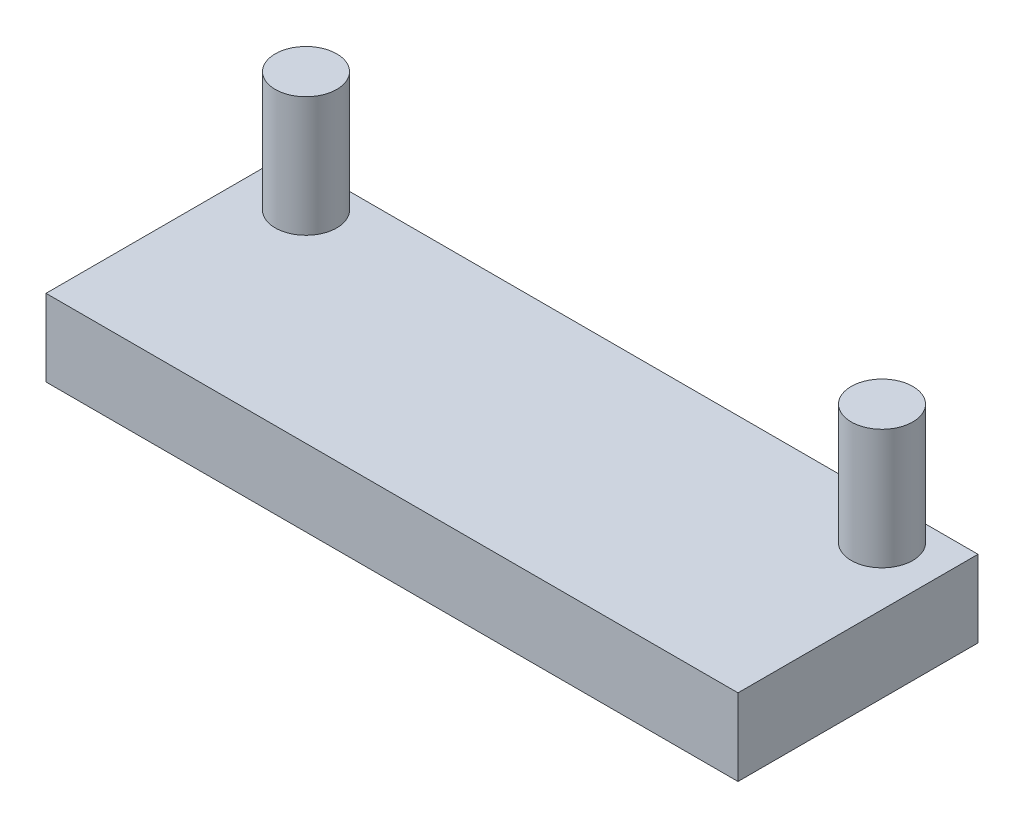
ISO-10303-21;
HEADER;
FILE_DESCRIPTION(('STEP AP214'),'2;1');
FILE_NAME('part.step','',(''),(''),'','','');
FILE_SCHEMA(('AUTOMOTIVE_DESIGN { 1 0 10303 214 1 1 1 1 }'));
ENDSEC;
DATA;
#1=APPLICATION_CONTEXT('core data for automotive mechanical design processes');
#2=APPLICATION_PROTOCOL_DEFINITION('international standard','automotive_design',2000,#1);
#3=PRODUCT_CONTEXT('',#1,'mechanical');
#4=PRODUCT('Part','Part','',(#3));
#5=PRODUCT_RELATED_PRODUCT_CATEGORY('part','',(#4));
#6=PRODUCT_DEFINITION_FORMATION('','',#4);
#7=PRODUCT_DEFINITION_CONTEXT('part definition',#1,'design');
#8=PRODUCT_DEFINITION('design','',#6,#7);
#9=PRODUCT_DEFINITION_SHAPE('','',#8);
#10=(LENGTH_UNIT() NAMED_UNIT(*) SI_UNIT(.MILLI.,.METRE.));
#11=(NAMED_UNIT(*) PLANE_ANGLE_UNIT() SI_UNIT($,.RADIAN.));
#12=(NAMED_UNIT(*) SI_UNIT($,.STERADIAN.) SOLID_ANGLE_UNIT());
#13=UNCERTAINTY_MEASURE_WITH_UNIT(LENGTH_MEASURE(1.E-05),#10,'distance_accuracy_value','');
#14=(GEOMETRIC_REPRESENTATION_CONTEXT(3) GLOBAL_UNCERTAINTY_ASSIGNED_CONTEXT((#13)) GLOBAL_UNIT_ASSIGNED_CONTEXT((#10,
#11,#12)) REPRESENTATION_CONTEXT('',''));
#15=CARTESIAN_POINT('',(0.,0.,0.));
#16=DIRECTION('',(0.,0.,1.));
#17=DIRECTION('',(1.,0.,0.));
#18=AXIS2_PLACEMENT_3D('',#15,#16,#17);
#19=CARTESIAN_POINT('',(10.9855,2.4384,-3.81));
#20=DIRECTION('',(0.,0.,1.));
#21=DIRECTION('',(1.,0.,0.));
#22=AXIS2_PLACEMENT_3D('',#19,#20,#21);
#23=PLANE('',#22);
#24=DIRECTION('',(-1.,0.,0.));
#25=VECTOR('',#24,1.);
#26=CARTESIAN_POINT('',(10.9855,0.,-3.81));
#27=LINE('',#26,#25);
#28=CARTESIAN_POINT('',(10.9855,0.,-3.81));
#29=VERTEX_POINT('',#28);
#30=CARTESIAN_POINT('',(-10.9855,0.,-3.81));
#31=VERTEX_POINT('',#30);
#32=EDGE_CURVE('E106',#29,#31,#27,.T.);
#33=ORIENTED_EDGE('',*,*,#32,.T.);
#34=DIRECTION('',(0.,-1.,0.));
#35=VECTOR('',#34,1.);
#36=CARTESIAN_POINT('',(-10.9855,2.4384,-3.81));
#37=LINE('',#36,#35);
#38=CARTESIAN_POINT('',(-10.9855,2.4384,-3.81));
#39=VERTEX_POINT('',#38);
#40=EDGE_CURVE('E45',#39,#31,#37,.T.);
#41=ORIENTED_EDGE('',*,*,#40,.F.);
#42=DIRECTION('',(-1.,0.,0.));
#43=VECTOR('',#42,1.);
#44=CARTESIAN_POINT('',(10.9855,2.4384,-3.81));
#45=LINE('',#44,#43);
#46=CARTESIAN_POINT('',(10.9855,2.4384,-3.81));
#47=VERTEX_POINT('',#46);
#48=EDGE_CURVE('E91',#47,#39,#45,.T.);
#49=ORIENTED_EDGE('',*,*,#48,.F.);
#50=DIRECTION('',(0.,-1.,0.));
#51=VECTOR('',#50,1.);
#52=CARTESIAN_POINT('',(10.9855,2.4384,-3.81));
#53=LINE('',#52,#51);
#54=EDGE_CURVE('E105',#47,#29,#53,.T.);
#55=ORIENTED_EDGE('',*,*,#54,.T.);
#56=EDGE_LOOP('',(#33,#41,#49,#55));
#57=FACE_BOUND('',#56,.T.);
#58=ADVANCED_FACE('F39',(#57),#23,.F.);
#59=CARTESIAN_POINT('',(-10.9855,2.4384,-3.81));
#60=DIRECTION('',(1.,0.,0.));
#61=DIRECTION('',(0.,0.,-1.));
#62=AXIS2_PLACEMENT_3D('',#59,#60,#61);
#63=PLANE('',#62);
#64=DIRECTION('',(0.,0.,1.));
#65=VECTOR('',#64,1.);
#66=CARTESIAN_POINT('',(-10.9855,0.,-3.81));
#67=LINE('',#66,#65);
#68=CARTESIAN_POINT('',(-10.9855,0.,3.81));
#69=VERTEX_POINT('',#68);
#70=EDGE_CURVE('E98',#31,#69,#67,.T.);
#71=ORIENTED_EDGE('',*,*,#70,.T.);
#72=DIRECTION('',(0.,-1.,0.));
#73=VECTOR('',#72,1.);
#74=CARTESIAN_POINT('',(-10.9855,2.4384,3.81));
#75=LINE('',#74,#73);
#76=CARTESIAN_POINT('',(-10.9855,2.4384,3.81));
#77=VERTEX_POINT('',#76);
#78=EDGE_CURVE('E96',#77,#69,#75,.T.);
#79=ORIENTED_EDGE('',*,*,#78,.F.);
#80=DIRECTION('',(0.,0.,1.));
#81=VECTOR('',#80,1.);
#82=CARTESIAN_POINT('',(-10.9855,2.4384,-3.81));
#83=LINE('',#82,#81);
#84=EDGE_CURVE('E86',#39,#77,#83,.T.);
#85=ORIENTED_EDGE('',*,*,#84,.F.);
#86=ORIENTED_EDGE('',*,*,#40,.T.);
#87=EDGE_LOOP('',(#71,#79,#85,#86));
#88=FACE_BOUND('',#87,.T.);
#89=ADVANCED_FACE('F100',(#88),#63,.F.);
#90=CARTESIAN_POINT('',(-10.9855,2.4384,3.81));
#91=DIRECTION('',(0.,0.,-1.));
#92=DIRECTION('',(-1.,0.,0.));
#93=AXIS2_PLACEMENT_3D('',#90,#91,#92);
#94=PLANE('',#93);
#95=DIRECTION('',(1.,0.,0.));
#96=VECTOR('',#95,1.);
#97=CARTESIAN_POINT('',(-10.9855,0.,3.81));
#98=LINE('',#97,#96);
#99=CARTESIAN_POINT('',(10.9855,0.,3.81));
#100=VERTEX_POINT('',#99);
#101=EDGE_CURVE('E74',#69,#100,#98,.T.);
#102=ORIENTED_EDGE('',*,*,#101,.T.);
#103=DIRECTION('',(0.,-1.,0.));
#104=VECTOR('',#103,1.);
#105=CARTESIAN_POINT('',(10.9855,2.4384,3.81));
#106=LINE('',#105,#104);
#107=CARTESIAN_POINT('',(10.9855,2.4384,3.81));
#108=VERTEX_POINT('',#107);
#109=EDGE_CURVE('E97',#108,#100,#106,.T.);
#110=ORIENTED_EDGE('',*,*,#109,.F.);
#111=DIRECTION('',(1.,0.,0.));
#112=VECTOR('',#111,1.);
#113=CARTESIAN_POINT('',(-10.9855,2.4384,3.81));
#114=LINE('',#113,#112);
#115=EDGE_CURVE('E93',#77,#108,#114,.T.);
#116=ORIENTED_EDGE('',*,*,#115,.F.);
#117=ORIENTED_EDGE('',*,*,#78,.T.);
#118=EDGE_LOOP('',(#102,#110,#116,#117));
#119=FACE_BOUND('',#118,.T.);
#120=ADVANCED_FACE('F99',(#119),#94,.F.);
#121=CARTESIAN_POINT('',(10.9855,2.4384,3.81));
#122=DIRECTION('',(-1.,0.,0.));
#123=DIRECTION('',(0.,0.,1.));
#124=AXIS2_PLACEMENT_3D('',#121,#122,#123);
#125=PLANE('',#124);
#126=DIRECTION('',(0.,0.,-1.));
#127=VECTOR('',#126,1.);
#128=CARTESIAN_POINT('',(10.9855,0.,3.81));
#129=LINE('',#128,#127);
#130=EDGE_CURVE('E77',#100,#29,#129,.T.);
#131=ORIENTED_EDGE('',*,*,#130,.T.);
#132=ORIENTED_EDGE('',*,*,#54,.F.);
#133=DIRECTION('',(0.,0.,-1.));
#134=VECTOR('',#133,1.);
#135=CARTESIAN_POINT('',(10.9855,2.4384,3.81));
#136=LINE('',#135,#134);
#137=EDGE_CURVE('E60',#108,#47,#136,.T.);
#138=ORIENTED_EDGE('',*,*,#137,.F.);
#139=ORIENTED_EDGE('',*,*,#109,.T.);
#140=EDGE_LOOP('',(#131,#132,#138,#139));
#141=FACE_BOUND('',#140,.T.);
#142=ADVANCED_FACE('F111',(#141),#125,.F.);
#143=CARTESIAN_POINT('',(0.,2.4384,0.));
#144=DIRECTION('',(0.,1.,0.));
#145=DIRECTION('',(0.,0.,1.));
#146=AXIS2_PLACEMENT_3D('',#143,#144,#145);
#147=PLANE('',#146);
#148=CARTESIAN_POINT('',(-9.144,2.4384,-2.60375203764824));
#149=DIRECTION('',(0.,1.,0.));
#150=DIRECTION('',(0.,0.,1.));
#151=AXIS2_PLACEMENT_3D('',#148,#149,#150);
#152=CIRCLE('',#151,0.9779);
#153=CARTESIAN_POINT('',(-9.144,2.4384,-3.58165203764824));
#154=VERTEX_POINT('',#153);
#155=EDGE_CURVE('E11',#154,#154,#152,.T.);
#156=ORIENTED_EDGE('',*,*,#155,.F.);
#157=EDGE_LOOP('',(#156));
#158=FACE_BOUND('',#157,.T.);
#159=CARTESIAN_POINT('',(9.144,2.4384,-2.60375203764824));
#160=DIRECTION('',(0.,1.,0.));
#161=DIRECTION('',(0.,0.,-1.));
#162=AXIS2_PLACEMENT_3D('',#159,#160,#161);
#163=CIRCLE('',#162,0.9779);
#164=CARTESIAN_POINT('',(9.144,2.4384,-3.58165203764824));
#165=VERTEX_POINT('',#164);
#166=EDGE_CURVE('E48',#165,#165,#163,.T.);
#167=ORIENTED_EDGE('',*,*,#166,.F.);
#168=EDGE_LOOP('',(#167));
#169=FACE_BOUND('',#168,.T.);
#170=ORIENTED_EDGE('',*,*,#48,.T.);
#171=ORIENTED_EDGE('',*,*,#84,.T.);
#172=ORIENTED_EDGE('',*,*,#115,.T.);
#173=ORIENTED_EDGE('',*,*,#137,.T.);
#174=EDGE_LOOP('',(#170,#171,#172,#173));
#175=FACE_BOUND('',#174,.T.);
#176=ADVANCED_FACE('F90',(#158,#169,#175),#147,.T.);
#177=CARTESIAN_POINT('',(0.,0.,0.));
#178=DIRECTION('',(0.,1.,0.));
#179=DIRECTION('',(0.,0.,1.));
#180=AXIS2_PLACEMENT_3D('',#177,#178,#179);
#181=PLANE('',#180);
#182=ORIENTED_EDGE('',*,*,#32,.F.);
#183=ORIENTED_EDGE('',*,*,#130,.F.);
#184=ORIENTED_EDGE('',*,*,#101,.F.);
#185=ORIENTED_EDGE('',*,*,#70,.F.);
#186=EDGE_LOOP('',(#182,#183,#184,#185));
#187=FACE_BOUND('',#186,.T.);
#188=ADVANCED_FACE('F116',(#187),#181,.F.);
#189=CARTESIAN_POINT('',(9.144,6.2484,-2.60375203764824));
#190=DIRECTION('',(0.,-1.,0.));
#191=DIRECTION('',(0.,0.,-1.));
#192=AXIS2_PLACEMENT_3D('',#189,#190,#191);
#193=CYLINDRICAL_SURFACE('',#192,0.9779);
#194=CARTESIAN_POINT('',(9.144,6.2484,-2.60375203764824));
#195=DIRECTION('',(0.,1.,0.));
#196=DIRECTION('',(0.,0.,-1.));
#197=AXIS2_PLACEMENT_3D('',#194,#195,#196);
#198=CIRCLE('',#197,0.9779);
#199=CARTESIAN_POINT('',(9.144,6.2484,-3.58165203764824));
#200=VERTEX_POINT('',#199);
#201=EDGE_CURVE('E117',#200,#200,#198,.T.);
#202=CARTESIAN_POINT('',(9.144,6.2484,-3.58165203764824));
#203=CARTESIAN_POINT('',(9.144,6.2087125,-3.58165203764824));
#204=CARTESIAN_POINT('',(9.144,6.169025,-3.58165203764824));
#205=CARTESIAN_POINT('',(9.144,6.08965,-3.58165203764824));
#206=CARTESIAN_POINT('',(9.144,6.0499625,-3.58165203764824));
#207=CARTESIAN_POINT('',(9.144,5.9705875,-3.58165203764824));
#208=CARTESIAN_POINT('',(9.144,5.9309,-3.58165203764824));
#209=CARTESIAN_POINT('',(9.144,5.851525,-3.58165203764824));
#210=CARTESIAN_POINT('',(9.144,5.8118375,-3.58165203764824));
#211=CARTESIAN_POINT('',(9.144,5.7324625,-3.58165203764824));
#212=CARTESIAN_POINT('',(9.144,5.692775,-3.58165203764824));
#213=CARTESIAN_POINT('',(9.144,5.6134,-3.58165203764824));
#214=CARTESIAN_POINT('',(9.144,5.5737125,-3.58165203764824));
#215=CARTESIAN_POINT('',(9.144,5.4943375,-3.58165203764824));
#216=CARTESIAN_POINT('',(9.144,5.45465,-3.58165203764824));
#217=CARTESIAN_POINT('',(9.144,5.375275,-3.58165203764824));
#218=CARTESIAN_POINT('',(9.144,5.3355875,-3.58165203764824));
#219=CARTESIAN_POINT('',(9.144,5.2562125,-3.58165203764824));
#220=CARTESIAN_POINT('',(9.144,5.216525,-3.58165203764824));
#221=CARTESIAN_POINT('',(9.144,5.13715,-3.58165203764824));
#222=CARTESIAN_POINT('',(9.144,5.0974625,-3.58165203764824));
#223=CARTESIAN_POINT('',(9.144,5.0180875,-3.58165203764824));
#224=CARTESIAN_POINT('',(9.144,4.9784,-3.58165203764824));
#225=CARTESIAN_POINT('',(9.144,4.899025,-3.58165203764824));
#226=CARTESIAN_POINT('',(9.144,4.8593375,-3.58165203764824));
#227=CARTESIAN_POINT('',(9.144,4.7799625,-3.58165203764824));
#228=CARTESIAN_POINT('',(9.144,4.740275,-3.58165203764824));
#229=CARTESIAN_POINT('',(9.144,4.6609,-3.58165203764824));
#230=CARTESIAN_POINT('',(9.144,4.6212125,-3.58165203764824));
#231=CARTESIAN_POINT('',(9.144,4.5418375,-3.58165203764824));
#232=CARTESIAN_POINT('',(9.144,4.50215,-3.58165203764824));
#233=CARTESIAN_POINT('',(9.144,4.422775,-3.58165203764824));
#234=CARTESIAN_POINT('',(9.144,4.3830875,-3.58165203764824));
#235=CARTESIAN_POINT('',(9.144,4.3037125,-3.58165203764824));
#236=CARTESIAN_POINT('',(9.144,4.264025,-3.58165203764824));
#237=CARTESIAN_POINT('',(9.144,4.18465,-3.58165203764824));
#238=CARTESIAN_POINT('',(9.144,4.1449625,-3.58165203764824));
#239=CARTESIAN_POINT('',(9.144,4.0655875,-3.58165203764824));
#240=CARTESIAN_POINT('',(9.144,4.0259,-3.58165203764824));
#241=CARTESIAN_POINT('',(9.144,3.946525,-3.58165203764824));
#242=CARTESIAN_POINT('',(9.144,3.9068375,-3.58165203764824));
#243=CARTESIAN_POINT('',(9.144,3.8274625,-3.58165203764824));
#244=CARTESIAN_POINT('',(9.144,3.787775,-3.58165203764824));
#245=CARTESIAN_POINT('',(9.144,3.7084,-3.58165203764824));
#246=CARTESIAN_POINT('',(9.144,3.6687125,-3.58165203764824));
#247=CARTESIAN_POINT('',(9.144,3.5893375,-3.58165203764824));
#248=CARTESIAN_POINT('',(9.144,3.54965,-3.58165203764824));
#249=CARTESIAN_POINT('',(9.144,3.470275,-3.58165203764824));
#250=CARTESIAN_POINT('',(9.144,3.4305875,-3.58165203764824));
#251=CARTESIAN_POINT('',(9.144,3.3512125,-3.58165203764824));
#252=CARTESIAN_POINT('',(9.144,3.311525,-3.58165203764824));
#253=CARTESIAN_POINT('',(9.144,3.23215,-3.58165203764824));
#254=CARTESIAN_POINT('',(9.144,3.1924625,-3.58165203764824));
#255=CARTESIAN_POINT('',(9.144,3.1130875,-3.58165203764824));
#256=CARTESIAN_POINT('',(9.144,3.0734,-3.58165203764824));
#257=CARTESIAN_POINT('',(9.144,2.994025,-3.58165203764824));
#258=CARTESIAN_POINT('',(9.144,2.9543375,-3.58165203764824));
#259=CARTESIAN_POINT('',(9.144,2.8749625,-3.58165203764824));
#260=CARTESIAN_POINT('',(9.144,2.835275,-3.58165203764824));
#261=CARTESIAN_POINT('',(9.144,2.7559,-3.58165203764824));
#262=CARTESIAN_POINT('',(9.144,2.7162125,-3.58165203764824));
#263=CARTESIAN_POINT('',(9.144,2.6368375,-3.58165203764824));
#264=CARTESIAN_POINT('',(9.144,2.59715,-3.58165203764824));
#265=CARTESIAN_POINT('',(9.144,2.517775,-3.58165203764824));
#266=CARTESIAN_POINT('',(9.144,2.4780875,-3.58165203764824));
#267=CARTESIAN_POINT('',(9.144,2.4384,-3.58165203764824));
#268=B_SPLINE_CURVE_WITH_KNOTS('',3,(#202,#203,#204,#205,#206,#207,#208,#209,#210,#211,#212,
#213,#214,#215,#216,#217,#218,#219,#220,#221,#222,#223,#224,#225,#226,#227,#228,#229,#230,#231,
#232,#233,#234,#235,#236,#237,#238,#239,#240,#241,#242,#243,#244,#245,#246,#247,#248,#249,#250,
#251,#252,#253,#254,#255,#256,#257,#258,#259,#260,#261,#262,#263,#264,#265,#266,#267),
.UNSPECIFIED.,.F.,.F.,(4,2,2,2,2,2,2,2,2,2,2,2,2,2,2,2,2,2,2,2,2,2,2,2,2,2,2,2,2,2,2,2,4),(0.,
0.1190625,0.238125,0.357187500000001,0.47625,0.5953125,0.714375000000001,0.8334375,0.9525,
1.0715625,1.190625,1.3096875,1.42875,1.5478125,1.666875,1.7859375,1.905,2.0240625,2.143125,
2.2621875,2.38125,2.5003125,2.619375,2.7384375,2.8575,2.9765625,3.095625,3.2146875,3.33375,
3.4528125,3.571875,3.6909375,3.81),.UNSPECIFIED.);
#269=EDGE_CURVE('BSEAM142',#200,#165,#268,.T.);
#270=ORIENTED_EDGE('',*,*,#201,.F.);
#271=ORIENTED_EDGE('',*,*,#166,.T.);
#272=ORIENTED_EDGE('',*,*,#269,.T.);
#273=ORIENTED_EDGE('',*,*,#269,.F.);
#274=EDGE_LOOP('',(#270,#272,#271,#273));
#275=FACE_BOUND('',#274,.T.);
#276=ADVANCED_FACE('F142',(#275),#193,.T.);
#277=CARTESIAN_POINT('',(9.144,6.2484,-2.60375203764824));
#278=DIRECTION('',(0.,-1.,0.));
#279=DIRECTION('',(0.,0.,-1.));
#280=AXIS2_PLACEMENT_3D('',#277,#278,#279);
#281=PLANE('',#280);
#282=ORIENTED_EDGE('',*,*,#201,.T.);
#283=EDGE_LOOP('',(#282));
#284=FACE_BOUND('',#283,.T.);
#285=ADVANCED_FACE('F135',(#284),#281,.F.);
#286=CARTESIAN_POINT('',(-9.144,6.2484,-2.60375203764824));
#287=DIRECTION('',(0.,-1.,0.));
#288=DIRECTION('',(0.,0.,-1.));
#289=AXIS2_PLACEMENT_3D('',#286,#287,#288);
#290=CYLINDRICAL_SURFACE('',#289,0.9779);
#291=CARTESIAN_POINT('',(-9.144,6.2484,-2.60375203764824));
#292=DIRECTION('',(0.,1.,0.));
#293=DIRECTION('',(0.,0.,1.));
#294=AXIS2_PLACEMENT_3D('',#291,#292,#293);
#295=CIRCLE('',#294,0.9779);
#296=CARTESIAN_POINT('',(-9.144,6.2484,-3.58165203764824));
#297=VERTEX_POINT('',#296);
#298=EDGE_CURVE('E108',#297,#297,#295,.T.);
#299=CARTESIAN_POINT('',(-9.144,6.2484,-3.58165203764824));
#300=CARTESIAN_POINT('',(-9.144,6.2087125,-3.58165203764824));
#301=CARTESIAN_POINT('',(-9.144,6.169025,-3.58165203764824));
#302=CARTESIAN_POINT('',(-9.144,6.08965,-3.58165203764824));
#303=CARTESIAN_POINT('',(-9.144,6.0499625,-3.58165203764824));
#304=CARTESIAN_POINT('',(-9.144,5.9705875,-3.58165203764824));
#305=CARTESIAN_POINT('',(-9.144,5.9309,-3.58165203764824));
#306=CARTESIAN_POINT('',(-9.144,5.851525,-3.58165203764824));
#307=CARTESIAN_POINT('',(-9.144,5.8118375,-3.58165203764824));
#308=CARTESIAN_POINT('',(-9.144,5.7324625,-3.58165203764824));
#309=CARTESIAN_POINT('',(-9.144,5.692775,-3.58165203764824));
#310=CARTESIAN_POINT('',(-9.144,5.6134,-3.58165203764824));
#311=CARTESIAN_POINT('',(-9.144,5.5737125,-3.58165203764824));
#312=CARTESIAN_POINT('',(-9.144,5.4943375,-3.58165203764824));
#313=CARTESIAN_POINT('',(-9.144,5.45465,-3.58165203764824));
#314=CARTESIAN_POINT('',(-9.144,5.375275,-3.58165203764824));
#315=CARTESIAN_POINT('',(-9.144,5.3355875,-3.58165203764824));
#316=CARTESIAN_POINT('',(-9.144,5.2562125,-3.58165203764824));
#317=CARTESIAN_POINT('',(-9.144,5.216525,-3.58165203764824));
#318=CARTESIAN_POINT('',(-9.144,5.13715,-3.58165203764824));
#319=CARTESIAN_POINT('',(-9.144,5.0974625,-3.58165203764824));
#320=CARTESIAN_POINT('',(-9.144,5.0180875,-3.58165203764824));
#321=CARTESIAN_POINT('',(-9.144,4.9784,-3.58165203764824));
#322=CARTESIAN_POINT('',(-9.144,4.899025,-3.58165203764824));
#323=CARTESIAN_POINT('',(-9.144,4.8593375,-3.58165203764824));
#324=CARTESIAN_POINT('',(-9.144,4.7799625,-3.58165203764824));
#325=CARTESIAN_POINT('',(-9.144,4.740275,-3.58165203764824));
#326=CARTESIAN_POINT('',(-9.144,4.6609,-3.58165203764824));
#327=CARTESIAN_POINT('',(-9.144,4.6212125,-3.58165203764824));
#328=CARTESIAN_POINT('',(-9.144,4.5418375,-3.58165203764824));
#329=CARTESIAN_POINT('',(-9.144,4.50215,-3.58165203764824));
#330=CARTESIAN_POINT('',(-9.144,4.422775,-3.58165203764824));
#331=CARTESIAN_POINT('',(-9.144,4.3830875,-3.58165203764824));
#332=CARTESIAN_POINT('',(-9.144,4.3037125,-3.58165203764824));
#333=CARTESIAN_POINT('',(-9.144,4.264025,-3.58165203764824));
#334=CARTESIAN_POINT('',(-9.144,4.18465,-3.58165203764824));
#335=CARTESIAN_POINT('',(-9.144,4.1449625,-3.58165203764824));
#336=CARTESIAN_POINT('',(-9.144,4.0655875,-3.58165203764824));
#337=CARTESIAN_POINT('',(-9.144,4.0259,-3.58165203764824));
#338=CARTESIAN_POINT('',(-9.144,3.946525,-3.58165203764824));
#339=CARTESIAN_POINT('',(-9.144,3.9068375,-3.58165203764824));
#340=CARTESIAN_POINT('',(-9.144,3.8274625,-3.58165203764824));
#341=CARTESIAN_POINT('',(-9.144,3.787775,-3.58165203764824));
#342=CARTESIAN_POINT('',(-9.144,3.7084,-3.58165203764824));
#343=CARTESIAN_POINT('',(-9.144,3.6687125,-3.58165203764824));
#344=CARTESIAN_POINT('',(-9.144,3.5893375,-3.58165203764824));
#345=CARTESIAN_POINT('',(-9.144,3.54965,-3.58165203764824));
#346=CARTESIAN_POINT('',(-9.144,3.470275,-3.58165203764824));
#347=CARTESIAN_POINT('',(-9.144,3.4305875,-3.58165203764824));
#348=CARTESIAN_POINT('',(-9.144,3.3512125,-3.58165203764824));
#349=CARTESIAN_POINT('',(-9.144,3.311525,-3.58165203764824));
#350=CARTESIAN_POINT('',(-9.144,3.23215,-3.58165203764824));
#351=CARTESIAN_POINT('',(-9.144,3.1924625,-3.58165203764824));
#352=CARTESIAN_POINT('',(-9.144,3.1130875,-3.58165203764824));
#353=CARTESIAN_POINT('',(-9.144,3.0734,-3.58165203764824));
#354=CARTESIAN_POINT('',(-9.144,2.994025,-3.58165203764824));
#355=CARTESIAN_POINT('',(-9.144,2.9543375,-3.58165203764824));
#356=CARTESIAN_POINT('',(-9.144,2.8749625,-3.58165203764824));
#357=CARTESIAN_POINT('',(-9.144,2.835275,-3.58165203764824));
#358=CARTESIAN_POINT('',(-9.144,2.7559,-3.58165203764824));
#359=CARTESIAN_POINT('',(-9.144,2.7162125,-3.58165203764824));
#360=CARTESIAN_POINT('',(-9.144,2.6368375,-3.58165203764824));
#361=CARTESIAN_POINT('',(-9.144,2.59715,-3.58165203764824));
#362=CARTESIAN_POINT('',(-9.144,2.517775,-3.58165203764824));
#363=CARTESIAN_POINT('',(-9.144,2.4780875,-3.58165203764824));
#364=CARTESIAN_POINT('',(-9.144,2.4384,-3.58165203764824));
#365=B_SPLINE_CURVE_WITH_KNOTS('',3,(#299,#300,#301,#302,#303,#304,#305,#306,#307,#308,#309,
#310,#311,#312,#313,#314,#315,#316,#317,#318,#319,#320,#321,#322,#323,#324,#325,#326,#327,#328,
#329,#330,#331,#332,#333,#334,#335,#336,#337,#338,#339,#340,#341,#342,#343,#344,#345,#346,#347,
#348,#349,#350,#351,#352,#353,#354,#355,#356,#357,#358,#359,#360,#361,#362,#363,#364),
.UNSPECIFIED.,.F.,.F.,(4,2,2,2,2,2,2,2,2,2,2,2,2,2,2,2,2,2,2,2,2,2,2,2,2,2,2,2,2,2,2,2,4),(0.,
0.1190625,0.238125,0.357187500000001,0.47625,0.5953125,0.714375000000001,0.8334375,0.9525,
1.0715625,1.190625,1.3096875,1.42875,1.5478125,1.666875,1.7859375,1.905,2.0240625,2.143125,
2.2621875,2.38125,2.5003125,2.619375,2.7384375,2.8575,2.9765625,3.095625,3.2146875,3.33375,
3.4528125,3.571875,3.6909375,3.81),.UNSPECIFIED.);
#366=EDGE_CURVE('BSEAM128',#297,#154,#365,.T.);
#367=ORIENTED_EDGE('',*,*,#298,.F.);
#368=ORIENTED_EDGE('',*,*,#155,.T.);
#369=ORIENTED_EDGE('',*,*,#366,.T.);
#370=ORIENTED_EDGE('',*,*,#366,.F.);
#371=EDGE_LOOP('',(#367,#369,#368,#370));
#372=FACE_BOUND('',#371,.T.);
#373=ADVANCED_FACE('F128',(#372),#290,.T.);
#374=CARTESIAN_POINT('',(-9.144,6.2484,-2.60375203764824));
#375=DIRECTION('',(0.,1.,0.));
#376=DIRECTION('',(0.,0.,1.));
#377=AXIS2_PLACEMENT_3D('',#374,#375,#376);
#378=PLANE('',#377);
#379=ORIENTED_EDGE('',*,*,#298,.T.);
#380=EDGE_LOOP('',(#379));
#381=FACE_BOUND('',#380,.T.);
#382=ADVANCED_FACE('F126',(#381),#378,.T.);
#383=CLOSED_SHELL('',(#58,#89,#120,#142,#176,#188,#276,#285,#373,#382));
#384=MANIFOLD_SOLID_BREP('B2',#383);
#385=ADVANCED_BREP_SHAPE_REPRESENTATION('',(#18,#384),#14);
#386=SHAPE_DEFINITION_REPRESENTATION(#9,#385);
ENDSEC;
END-ISO-10303-21;
